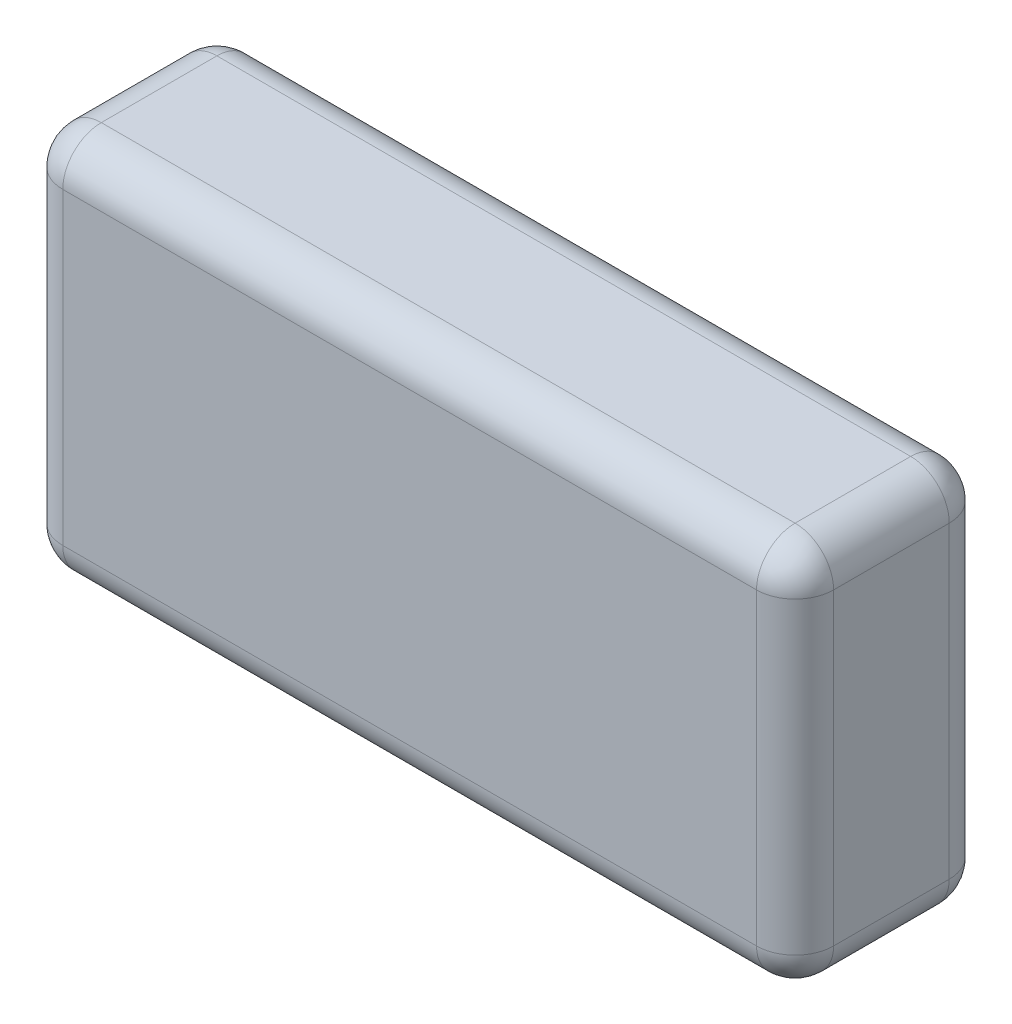
ISO-10303-21;
HEADER;
FILE_DESCRIPTION(('STEP AP214'),'2;1');
FILE_NAME('part.step','',(''),(''),'','','');
FILE_SCHEMA(('AUTOMOTIVE_DESIGN { 1 0 10303 214 1 1 1 1 }'));
ENDSEC;
DATA;
#1=APPLICATION_CONTEXT('core data for automotive mechanical design processes');
#2=APPLICATION_PROTOCOL_DEFINITION('international standard','automotive_design',2000,#1);
#3=PRODUCT_CONTEXT('',#1,'mechanical');
#4=PRODUCT('Part','Part','',(#3));
#5=PRODUCT_RELATED_PRODUCT_CATEGORY('part','',(#4));
#6=PRODUCT_DEFINITION_FORMATION('','',#4);
#7=PRODUCT_DEFINITION_CONTEXT('part definition',#1,'design');
#8=PRODUCT_DEFINITION('design','',#6,#7);
#9=PRODUCT_DEFINITION_SHAPE('','',#8);
#10=(LENGTH_UNIT() NAMED_UNIT(*) SI_UNIT(.MILLI.,.METRE.));
#11=(NAMED_UNIT(*) PLANE_ANGLE_UNIT() SI_UNIT($,.RADIAN.));
#12=(NAMED_UNIT(*) SI_UNIT($,.STERADIAN.) SOLID_ANGLE_UNIT());
#13=UNCERTAINTY_MEASURE_WITH_UNIT(LENGTH_MEASURE(1.E-05),#10,'distance_accuracy_value','');
#14=(GEOMETRIC_REPRESENTATION_CONTEXT(3) GLOBAL_UNCERTAINTY_ASSIGNED_CONTEXT((#13)) GLOBAL_UNIT_ASSIGNED_CONTEXT((#10,
#11,#12)) REPRESENTATION_CONTEXT('',''));
#15=CARTESIAN_POINT('',(0.,0.,0.));
#16=DIRECTION('',(0.,0.,1.));
#17=DIRECTION('',(1.,0.,0.));
#18=AXIS2_PLACEMENT_3D('',#15,#16,#17);
#19=CARTESIAN_POINT('',(-54.0520418666152,100.,-23.4294738015234));
#20=DIRECTION('',(1.,0.,0.));
#21=DIRECTION('',(0.,0.,-1.));
#22=AXIS2_PLACEMENT_3D('',#19,#20,#21);
#23=PLANE('',#22);
#24=DIRECTION('',(0.,0.,1.));
#25=VECTOR('',#24,1.);
#26=CARTESIAN_POINT('',(-54.0520418666152,90.,-23.4294738015234));
#27=LINE('',#26,#25);
#28=CARTESIAN_POINT('',(-54.0520418666152,90.,16.5705261984766));
#29=VERTEX_POINT('',#28);
#30=CARTESIAN_POINT('',(-54.0520418666152,90.,-13.4294738015234));
#31=VERTEX_POINT('',#30);
#32=EDGE_CURVE('E49',#29,#31,#27,.F.);
#33=ORIENTED_EDGE('',*,*,#32,.T.);
#34=DIRECTION('',(0.,-1.,0.));
#35=VECTOR('',#34,1.);
#36=CARTESIAN_POINT('',(-54.0520418666152,100.,-13.4294738015234));
#37=LINE('',#36,#35);
#38=CARTESIAN_POINT('',(-54.0520418666152,9.99999999999999,-13.4294738015234));
#39=VERTEX_POINT('',#38);
#40=EDGE_CURVE('E11',#31,#39,#37,.T.);
#41=ORIENTED_EDGE('',*,*,#40,.T.);
#42=DIRECTION('',(0.,0.,1.));
#43=VECTOR('',#42,1.);
#44=CARTESIAN_POINT('',(-54.0520418666152,9.99999999999999,-23.4294738015234));
#45=LINE('',#44,#43);
#46=CARTESIAN_POINT('',(-54.0520418666152,9.99999999999999,16.5705261984766));
#47=VERTEX_POINT('',#46);
#48=EDGE_CURVE('E266',#39,#47,#45,.T.);
#49=ORIENTED_EDGE('',*,*,#48,.T.);
#50=DIRECTION('',(0.,-1.,0.));
#51=VECTOR('',#50,1.);
#52=CARTESIAN_POINT('',(-54.0520418666152,100.,16.5705261984766));
#53=LINE('',#52,#51);
#54=EDGE_CURVE('E60',#47,#29,#53,.F.);
#55=ORIENTED_EDGE('',*,*,#54,.T.);
#56=EDGE_LOOP('',(#33,#41,#49,#55));
#57=FACE_BOUND('',#56,.T.);
#58=ADVANCED_FACE('F39',(#57),#23,.F.);
#59=CARTESIAN_POINT('',(-54.0520418666152,100.,26.5705261984766));
#60=DIRECTION('',(0.,0.,-1.));
#61=DIRECTION('',(-1.,0.,0.));
#62=AXIS2_PLACEMENT_3D('',#59,#60,#61);
#63=PLANE('',#62);
#64=DIRECTION('',(0.,-1.,0.));
#65=VECTOR('',#64,1.);
#66=CARTESIAN_POINT('',(135.947958133385,100.,26.5705261984766));
#67=LINE('',#66,#65);
#68=CARTESIAN_POINT('',(135.947958133385,9.99999999999999,26.5705261984766));
#69=VERTEX_POINT('',#68);
#70=CARTESIAN_POINT('',(135.947958133385,90.,26.5705261984766));
#71=VERTEX_POINT('',#70);
#72=EDGE_CURVE('E327',#69,#71,#67,.F.);
#73=ORIENTED_EDGE('',*,*,#72,.T.);
#74=DIRECTION('',(1.,0.,0.));
#75=VECTOR('',#74,1.);
#76=CARTESIAN_POINT('',(-54.0520418666152,90.,26.5705261984766));
#77=LINE('',#76,#75);
#78=CARTESIAN_POINT('',(-44.0520418666152,90.,26.5705261984766));
#79=VERTEX_POINT('',#78);
#80=EDGE_CURVE('E238',#71,#79,#77,.F.);
#81=ORIENTED_EDGE('',*,*,#80,.T.);
#82=DIRECTION('',(0.,-1.,0.));
#83=VECTOR('',#82,1.);
#84=CARTESIAN_POINT('',(-44.0520418666152,100.,26.5705261984766));
#85=LINE('',#84,#83);
#86=CARTESIAN_POINT('',(-44.0520418666152,9.99999999999999,26.5705261984766));
#87=VERTEX_POINT('',#86);
#88=EDGE_CURVE('E318',#79,#87,#85,.T.);
#89=ORIENTED_EDGE('',*,*,#88,.T.);
#90=DIRECTION('',(1.,0.,0.));
#91=VECTOR('',#90,1.);
#92=CARTESIAN_POINT('',(-54.0520418666152,9.99999999999999,26.5705261984766));
#93=LINE('',#92,#91);
#94=EDGE_CURVE('E321',#87,#69,#93,.T.);
#95=ORIENTED_EDGE('',*,*,#94,.T.);
#96=EDGE_LOOP('',(#73,#81,#89,#95));
#97=FACE_BOUND('',#96,.T.);
#98=ADVANCED_FACE('F359',(#97),#63,.F.);
#99=CARTESIAN_POINT('',(145.947958133385,100.,-23.4294738015234));
#100=DIRECTION('',(-1.,0.,0.));
#101=DIRECTION('',(0.,0.,1.));
#102=AXIS2_PLACEMENT_3D('',#99,#100,#101);
#103=PLANE('',#102);
#104=DIRECTION('',(0.,-1.,0.));
#105=VECTOR('',#104,1.);
#106=CARTESIAN_POINT('',(145.947958133385,100.,-13.4294738015234));
#107=LINE('',#106,#105);
#108=CARTESIAN_POINT('',(145.947958133385,9.99999999999999,-13.4294738015234));
#109=VERTEX_POINT('',#108);
#110=CARTESIAN_POINT('',(145.947958133385,90.,-13.4294738015234));
#111=VERTEX_POINT('',#110);
#112=EDGE_CURVE('E313',#109,#111,#107,.F.);
#113=ORIENTED_EDGE('',*,*,#112,.T.);
#114=DIRECTION('',(0.,0.,-1.));
#115=VECTOR('',#114,1.);
#116=CARTESIAN_POINT('',(145.947958133385,90.,26.5705261984766));
#117=LINE('',#116,#115);
#118=CARTESIAN_POINT('',(145.947958133385,90.,16.5705261984766));
#119=VERTEX_POINT('',#118);
#120=EDGE_CURVE('E307',#111,#119,#117,.F.);
#121=ORIENTED_EDGE('',*,*,#120,.T.);
#122=DIRECTION('',(0.,-1.,0.));
#123=VECTOR('',#122,1.);
#124=CARTESIAN_POINT('',(145.947958133385,100.,16.5705261984766));
#125=LINE('',#124,#123);
#126=CARTESIAN_POINT('',(145.947958133385,9.99999999999999,16.5705261984766));
#127=VERTEX_POINT('',#126);
#128=EDGE_CURVE('E300',#119,#127,#125,.T.);
#129=ORIENTED_EDGE('',*,*,#128,.T.);
#130=DIRECTION('',(0.,0.,-1.));
#131=VECTOR('',#130,1.);
#132=CARTESIAN_POINT('',(145.947958133385,9.99999999999999,-23.4294738015234));
#133=LINE('',#132,#131);
#134=EDGE_CURVE('E308',#127,#109,#133,.T.);
#135=ORIENTED_EDGE('',*,*,#134,.T.);
#136=EDGE_LOOP('',(#113,#121,#129,#135));
#137=FACE_BOUND('',#136,.T.);
#138=ADVANCED_FACE('F311',(#137),#103,.F.);
#139=CARTESIAN_POINT('',(-54.0520418666152,100.,-23.4294738015234));
#140=DIRECTION('',(0.,0.,1.));
#141=DIRECTION('',(1.,0.,0.));
#142=AXIS2_PLACEMENT_3D('',#139,#140,#141);
#143=PLANE('',#142);
#144=DIRECTION('',(-1.,0.,0.));
#145=VECTOR('',#144,1.);
#146=CARTESIAN_POINT('',(145.947958133385,90.,-23.4294738015234));
#147=LINE('',#146,#145);
#148=CARTESIAN_POINT('',(-44.0520418666152,90.,-23.4294738015234));
#149=VERTEX_POINT('',#148);
#150=CARTESIAN_POINT('',(135.947958133385,90.,-23.4294738015234));
#151=VERTEX_POINT('',#150);
#152=EDGE_CURVE('E162',#149,#151,#147,.F.);
#153=ORIENTED_EDGE('',*,*,#152,.T.);
#154=DIRECTION('',(0.,-1.,0.));
#155=VECTOR('',#154,1.);
#156=CARTESIAN_POINT('',(135.947958133385,100.,-23.4294738015234));
#157=LINE('',#156,#155);
#158=CARTESIAN_POINT('',(135.947958133385,9.99999999999999,-23.4294738015234));
#159=VERTEX_POINT('',#158);
#160=EDGE_CURVE('E262',#151,#159,#157,.T.);
#161=ORIENTED_EDGE('',*,*,#160,.T.);
#162=DIRECTION('',(-1.,0.,0.));
#163=VECTOR('',#162,1.);
#164=CARTESIAN_POINT('',(-54.0520418666152,9.99999999999999,-23.4294738015234));
#165=LINE('',#164,#163);
#166=CARTESIAN_POINT('',(-44.0520418666152,9.99999999999999,-23.4294738015234));
#167=VERTEX_POINT('',#166);
#168=EDGE_CURVE('E253',#159,#167,#165,.T.);
#169=ORIENTED_EDGE('',*,*,#168,.T.);
#170=DIRECTION('',(0.,-1.,0.));
#171=VECTOR('',#170,1.);
#172=CARTESIAN_POINT('',(-44.0520418666152,100.,-23.4294738015234));
#173=LINE('',#172,#171);
#174=EDGE_CURVE('E249',#167,#149,#173,.F.);
#175=ORIENTED_EDGE('',*,*,#174,.T.);
#176=EDGE_LOOP('',(#153,#161,#169,#175));
#177=FACE_BOUND('',#176,.T.);
#178=ADVANCED_FACE('F543',(#177),#143,.F.);
#179=CARTESIAN_POINT('',(0.,100.,0.));
#180=DIRECTION('',(0.,1.,0.));
#181=DIRECTION('',(0.,0.,1.));
#182=AXIS2_PLACEMENT_3D('',#179,#180,#181);
#183=PLANE('',#182);
#184=DIRECTION('',(1.,0.,0.));
#185=VECTOR('',#184,1.);
#186=CARTESIAN_POINT('',(145.947958133385,100.,16.5705261984766));
#187=LINE('',#186,#185);
#188=CARTESIAN_POINT('',(-44.0520418666152,100.,16.5705261984766));
#189=VERTEX_POINT('',#188);
#190=CARTESIAN_POINT('',(135.947958133385,100.,16.5705261984766));
#191=VERTEX_POINT('',#190);
#192=EDGE_CURVE('E139',#189,#191,#187,.T.);
#193=ORIENTED_EDGE('',*,*,#192,.T.);
#194=DIRECTION('',(0.,0.,-1.));
#195=VECTOR('',#194,1.);
#196=CARTESIAN_POINT('',(135.947958133385,100.,-23.4294738015234));
#197=LINE('',#196,#195);
#198=CARTESIAN_POINT('',(135.947958133385,100.,-13.4294738015234));
#199=VERTEX_POINT('',#198);
#200=EDGE_CURVE('E134',#191,#199,#197,.T.);
#201=ORIENTED_EDGE('',*,*,#200,.T.);
#202=DIRECTION('',(-1.,0.,0.));
#203=VECTOR('',#202,1.);
#204=CARTESIAN_POINT('',(-54.0520418666152,100.,-13.4294738015234));
#205=LINE('',#204,#203);
#206=CARTESIAN_POINT('',(-44.0520418666152,100.,-13.4294738015234));
#207=VERTEX_POINT('',#206);
#208=EDGE_CURVE('E128',#199,#207,#205,.T.);
#209=ORIENTED_EDGE('',*,*,#208,.T.);
#210=DIRECTION('',(0.,0.,1.));
#211=VECTOR('',#210,1.);
#212=CARTESIAN_POINT('',(-44.0520418666152,100.,26.5705261984766));
#213=LINE('',#212,#211);
#214=EDGE_CURVE('E131',#207,#189,#213,.T.);
#215=ORIENTED_EDGE('',*,*,#214,.T.);
#216=EDGE_LOOP('',(#193,#201,#209,#215));
#217=FACE_BOUND('',#216,.T.);
#218=ADVANCED_FACE('F130',(#217),#183,.T.);
#219=CARTESIAN_POINT('',(0.,0.,0.));
#220=DIRECTION('',(0.,1.,0.));
#221=DIRECTION('',(0.,0.,1.));
#222=AXIS2_PLACEMENT_3D('',#219,#220,#221);
#223=PLANE('',#222);
#224=DIRECTION('',(0.,0.,-1.));
#225=VECTOR('',#224,1.);
#226=CARTESIAN_POINT('',(135.947958133385,0.,0.));
#227=LINE('',#226,#225);
#228=CARTESIAN_POINT('',(135.947958133385,0.,-13.4294738015234));
#229=VERTEX_POINT('',#228);
#230=CARTESIAN_POINT('',(135.947958133385,0.,16.5705261984766));
#231=VERTEX_POINT('',#230);
#232=EDGE_CURVE('E244',#229,#231,#227,.F.);
#233=ORIENTED_EDGE('',*,*,#232,.T.);
#234=DIRECTION('',(1.,0.,0.));
#235=VECTOR('',#234,1.);
#236=CARTESIAN_POINT('',(0.,0.,16.5705261984766));
#237=LINE('',#236,#235);
#238=CARTESIAN_POINT('',(-44.0520418666152,0.,16.5705261984766));
#239=VERTEX_POINT('',#238);
#240=EDGE_CURVE('E241',#231,#239,#237,.F.);
#241=ORIENTED_EDGE('',*,*,#240,.T.);
#242=DIRECTION('',(0.,0.,1.));
#243=VECTOR('',#242,1.);
#244=CARTESIAN_POINT('',(-44.0520418666152,0.,0.));
#245=LINE('',#244,#243);
#246=CARTESIAN_POINT('',(-44.0520418666152,0.,-13.4294738015234));
#247=VERTEX_POINT('',#246);
#248=EDGE_CURVE('E233',#239,#247,#245,.F.);
#249=ORIENTED_EDGE('',*,*,#248,.T.);
#250=DIRECTION('',(-1.,0.,0.));
#251=VECTOR('',#250,1.);
#252=CARTESIAN_POINT('',(0.,0.,-13.4294738015234));
#253=LINE('',#252,#251);
#254=EDGE_CURVE('E237',#247,#229,#253,.F.);
#255=ORIENTED_EDGE('',*,*,#254,.T.);
#256=EDGE_LOOP('',(#233,#241,#249,#255));
#257=FACE_BOUND('',#256,.T.);
#258=ADVANCED_FACE('F242',(#257),#223,.F.);
#259=CARTESIAN_POINT('',(-44.0520418666152,9.99999999999999,-23.4294738015234));
#260=DIRECTION('',(0.,0.,1.));
#261=DIRECTION('',(1.,0.,0.));
#262=AXIS2_PLACEMENT_3D('',#259,#260,#261);
#263=CYLINDRICAL_SURFACE('',#262,10.);
#264=CARTESIAN_POINT('',(-44.0520418666152,9.99999999999999,16.5705261984766));
#265=DIRECTION('',(0.,0.,1.));
#266=DIRECTION('',(1.,0.,0.));
#267=AXIS2_PLACEMENT_3D('',#264,#265,#266);
#268=CIRCLE('',#267,10.);
#269=EDGE_CURVE('E43',#47,#239,#268,.T.);
#270=ORIENTED_EDGE('',*,*,#269,.F.);
#271=ORIENTED_EDGE('',*,*,#48,.F.);
#272=CARTESIAN_POINT('',(-44.0520418666152,10.,-13.4294738015234));
#273=DIRECTION('',(0.,0.,-1.));
#274=DIRECTION('',(-1.,0.,0.));
#275=AXIS2_PLACEMENT_3D('',#272,#273,#274);
#276=CIRCLE('',#275,10.);
#277=EDGE_CURVE('E215',#247,#39,#276,.T.);
#278=ORIENTED_EDGE('',*,*,#277,.F.);
#279=ORIENTED_EDGE('',*,*,#248,.F.);
#280=EDGE_LOOP('',(#270,#271,#278,#279));
#281=FACE_BOUND('',#280,.T.);
#282=ADVANCED_FACE('F41',(#281),#263,.T.);
#283=CARTESIAN_POINT('',(-44.0520418666152,10.,16.5705261984766));
#284=DIRECTION('',(0.,0.,1.));
#285=DIRECTION('',(1.,0.,0.));
#286=AXIS2_PLACEMENT_3D('',#283,#284,#285);
#287=SPHERICAL_SURFACE('',#286,10.);
#288=CARTESIAN_POINT('',(-44.0520418666152,9.99999999999999,16.5705261984766));
#289=DIRECTION('',(0.,-1.,0.));
#290=DIRECTION('',(0.,0.,-1.));
#291=AXIS2_PLACEMENT_3D('',#288,#289,#290);
#292=CIRCLE('',#291,10.);
#293=EDGE_CURVE('E209',#47,#87,#292,.F.);
#294=ORIENTED_EDGE('',*,*,#293,.F.);
#295=ORIENTED_EDGE('',*,*,#269,.T.);
#296=CARTESIAN_POINT('',(-44.0520418666152,10.,16.5705261984766));
#297=DIRECTION('',(-1.,0.,0.));
#298=DIRECTION('',(0.,0.,1.));
#299=AXIS2_PLACEMENT_3D('',#296,#297,#298);
#300=CIRCLE('',#299,10.);
#301=EDGE_CURVE('E213',#87,#239,#300,.F.);
#302=ORIENTED_EDGE('',*,*,#301,.F.);
#303=EDGE_LOOP('',(#294,#295,#302));
#304=FACE_BOUND('',#303,.T.);
#305=ADVANCED_FACE('F230',(#304),#287,.T.);
#306=CARTESIAN_POINT('',(-44.0520418666152,10.,-13.4294738015234));
#307=DIRECTION('',(0.,0.,1.));
#308=DIRECTION('',(1.,0.,0.));
#309=AXIS2_PLACEMENT_3D('',#306,#307,#308);
#310=SPHERICAL_SURFACE('',#309,10.);
#311=CARTESIAN_POINT('',(-44.0520418666152,9.99999999999999,-13.4294738015234));
#312=DIRECTION('',(-1.,0.,0.));
#313=DIRECTION('',(0.,0.,1.));
#314=AXIS2_PLACEMENT_3D('',#311,#312,#313);
#315=CIRCLE('',#314,10.);
#316=EDGE_CURVE('E202',#247,#167,#315,.F.);
#317=ORIENTED_EDGE('',*,*,#316,.F.);
#318=ORIENTED_EDGE('',*,*,#277,.T.);
#319=CARTESIAN_POINT('',(-44.0520418666152,9.99999999999999,-13.4294738015234));
#320=DIRECTION('',(0.,-1.,0.));
#321=DIRECTION('',(0.,0.,-1.));
#322=AXIS2_PLACEMENT_3D('',#319,#320,#321);
#323=CIRCLE('',#322,10.);
#324=EDGE_CURVE('E206',#167,#39,#323,.F.);
#325=ORIENTED_EDGE('',*,*,#324,.F.);
#326=EDGE_LOOP('',(#317,#318,#325));
#327=FACE_BOUND('',#326,.T.);
#328=ADVANCED_FACE('F509',(#327),#310,.T.);
#329=CARTESIAN_POINT('',(-54.0520418666152,9.99999999999999,16.5705261984766));
#330=DIRECTION('',(1.,0.,0.));
#331=DIRECTION('',(0.,0.,-1.));
#332=AXIS2_PLACEMENT_3D('',#329,#330,#331);
#333=CYLINDRICAL_SURFACE('',#332,10.);
#334=ORIENTED_EDGE('',*,*,#301,.T.);
#335=ORIENTED_EDGE('',*,*,#240,.F.);
#336=CARTESIAN_POINT('',(135.947958133385,9.99999999999999,16.5705261984766));
#337=DIRECTION('',(1.,0.,0.));
#338=DIRECTION('',(0.,0.,-1.));
#339=AXIS2_PLACEMENT_3D('',#336,#337,#338);
#340=CIRCLE('',#339,10.);
#341=EDGE_CURVE('E194',#69,#231,#340,.T.);
#342=ORIENTED_EDGE('',*,*,#341,.F.);
#343=ORIENTED_EDGE('',*,*,#94,.F.);
#344=EDGE_LOOP('',(#334,#335,#342,#343));
#345=FACE_BOUND('',#344,.T.);
#346=ADVANCED_FACE('F361',(#345),#333,.T.);
#347=CARTESIAN_POINT('',(-44.0520418666152,100.,16.5705261984766));
#348=DIRECTION('',(0.,-1.,0.));
#349=DIRECTION('',(0.,0.,-1.));
#350=AXIS2_PLACEMENT_3D('',#347,#348,#349);
#351=CYLINDRICAL_SURFACE('',#350,10.);
#352=ORIENTED_EDGE('',*,*,#293,.T.);
#353=ORIENTED_EDGE('',*,*,#88,.F.);
#354=CARTESIAN_POINT('',(-44.0520418666152,90.,16.5705261984766));
#355=DIRECTION('',(0.,1.,0.));
#356=DIRECTION('',(0.,0.,1.));
#357=AXIS2_PLACEMENT_3D('',#354,#355,#356);
#358=CIRCLE('',#357,10.);
#359=EDGE_CURVE('E190',#29,#79,#358,.T.);
#360=ORIENTED_EDGE('',*,*,#359,.F.);
#361=ORIENTED_EDGE('',*,*,#54,.F.);
#362=EDGE_LOOP('',(#352,#353,#360,#361));
#363=FACE_BOUND('',#362,.T.);
#364=ADVANCED_FACE('F493',(#363),#351,.T.);
#365=CARTESIAN_POINT('',(-44.0520418666152,90.,0.));
#366=DIRECTION('',(0.,0.,-1.));
#367=DIRECTION('',(-1.,0.,0.));
#368=AXIS2_PLACEMENT_3D('',#365,#366,#367);
#369=CYLINDRICAL_SURFACE('',#368,10.);
#370=CARTESIAN_POINT('',(-44.0520418666152,90.,-13.4294738015234));
#371=DIRECTION('',(0.,0.,-1.));
#372=DIRECTION('',(-1.,0.,0.));
#373=AXIS2_PLACEMENT_3D('',#370,#371,#372);
#374=CIRCLE('',#373,10.);
#375=EDGE_CURVE('E145',#31,#207,#374,.T.);
#376=ORIENTED_EDGE('',*,*,#375,.F.);
#377=ORIENTED_EDGE('',*,*,#32,.F.);
#378=CARTESIAN_POINT('',(-44.0520418666152,90.,16.5705261984766));
#379=DIRECTION('',(0.,0.,1.));
#380=DIRECTION('',(1.,0.,0.));
#381=AXIS2_PLACEMENT_3D('',#378,#379,#380);
#382=CIRCLE('',#381,10.);
#383=EDGE_CURVE('E148',#189,#29,#382,.T.);
#384=ORIENTED_EDGE('',*,*,#383,.F.);
#385=ORIENTED_EDGE('',*,*,#214,.F.);
#386=EDGE_LOOP('',(#376,#377,#384,#385));
#387=FACE_BOUND('',#386,.T.);
#388=ADVANCED_FACE('F144',(#387),#369,.T.);
#389=CARTESIAN_POINT('',(-44.0520418666152,100.,-13.4294738015234));
#390=DIRECTION('',(0.,-1.,0.));
#391=DIRECTION('',(0.,0.,-1.));
#392=AXIS2_PLACEMENT_3D('',#389,#390,#391);
#393=CYLINDRICAL_SURFACE('',#392,10.);
#394=ORIENTED_EDGE('',*,*,#324,.T.);
#395=ORIENTED_EDGE('',*,*,#40,.F.);
#396=CARTESIAN_POINT('',(-44.0520418666152,90.,-13.4294738015234));
#397=DIRECTION('',(0.,1.,0.));
#398=DIRECTION('',(0.,0.,1.));
#399=AXIS2_PLACEMENT_3D('',#396,#397,#398);
#400=CIRCLE('',#399,10.);
#401=EDGE_CURVE('E158',#149,#31,#400,.T.);
#402=ORIENTED_EDGE('',*,*,#401,.F.);
#403=ORIENTED_EDGE('',*,*,#174,.F.);
#404=EDGE_LOOP('',(#394,#395,#402,#403));
#405=FACE_BOUND('',#404,.T.);
#406=ADVANCED_FACE('F477',(#405),#393,.T.);
#407=CARTESIAN_POINT('',(-54.0520418666152,9.99999999999999,-13.4294738015234));
#408=DIRECTION('',(-1.,0.,0.));
#409=DIRECTION('',(0.,0.,1.));
#410=AXIS2_PLACEMENT_3D('',#407,#408,#409);
#411=CYLINDRICAL_SURFACE('',#410,10.);
#412=ORIENTED_EDGE('',*,*,#316,.T.);
#413=ORIENTED_EDGE('',*,*,#168,.F.);
#414=CARTESIAN_POINT('',(135.947958133385,10.,-13.4294738015234));
#415=DIRECTION('',(1.,0.,0.));
#416=DIRECTION('',(0.,0.,-1.));
#417=AXIS2_PLACEMENT_3D('',#414,#415,#416);
#418=CIRCLE('',#417,10.);
#419=EDGE_CURVE('E182',#229,#159,#418,.T.);
#420=ORIENTED_EDGE('',*,*,#419,.F.);
#421=ORIENTED_EDGE('',*,*,#254,.F.);
#422=EDGE_LOOP('',(#412,#413,#420,#421));
#423=FACE_BOUND('',#422,.T.);
#424=ADVANCED_FACE('F341',(#423),#411,.T.);
#425=CARTESIAN_POINT('',(135.947958133385,9.99999999999999,-23.4294738015234));
#426=DIRECTION('',(0.,0.,-1.));
#427=DIRECTION('',(-1.,0.,0.));
#428=AXIS2_PLACEMENT_3D('',#425,#426,#427);
#429=CYLINDRICAL_SURFACE('',#428,10.);
#430=CARTESIAN_POINT('',(135.947958133385,10.,16.5705261984766));
#431=DIRECTION('',(0.,0.,1.));
#432=DIRECTION('',(1.,0.,0.));
#433=AXIS2_PLACEMENT_3D('',#430,#431,#432);
#434=CIRCLE('',#433,10.);
#435=EDGE_CURVE('E198',#231,#127,#434,.T.);
#436=ORIENTED_EDGE('',*,*,#435,.F.);
#437=ORIENTED_EDGE('',*,*,#232,.F.);
#438=CARTESIAN_POINT('',(135.947958133385,9.99999999999999,-13.4294738015234));
#439=DIRECTION('',(0.,0.,-1.));
#440=DIRECTION('',(-1.,0.,0.));
#441=AXIS2_PLACEMENT_3D('',#438,#439,#440);
#442=CIRCLE('',#441,10.);
#443=EDGE_CURVE('E178',#109,#229,#442,.T.);
#444=ORIENTED_EDGE('',*,*,#443,.F.);
#445=ORIENTED_EDGE('',*,*,#134,.F.);
#446=EDGE_LOOP('',(#436,#437,#444,#445));
#447=FACE_BOUND('',#446,.T.);
#448=ADVANCED_FACE('F338',(#447),#429,.T.);
#449=CARTESIAN_POINT('',(135.947958133385,10.,16.5705261984766));
#450=DIRECTION('',(0.,0.,1.));
#451=DIRECTION('',(1.,0.,0.));
#452=AXIS2_PLACEMENT_3D('',#449,#450,#451);
#453=SPHERICAL_SURFACE('',#452,10.);
#454=ORIENTED_EDGE('',*,*,#341,.T.);
#455=ORIENTED_EDGE('',*,*,#435,.T.);
#456=CARTESIAN_POINT('',(135.947958133385,9.99999999999999,16.5705261984766));
#457=DIRECTION('',(0.,-1.,0.));
#458=DIRECTION('',(0.,0.,-1.));
#459=AXIS2_PLACEMENT_3D('',#456,#457,#458);
#460=CIRCLE('',#459,10.);
#461=EDGE_CURVE('E169',#69,#127,#460,.F.);
#462=ORIENTED_EDGE('',*,*,#461,.F.);
#463=EDGE_LOOP('',(#454,#455,#462));
#464=FACE_BOUND('',#463,.T.);
#465=ADVANCED_FACE('F363',(#464),#453,.T.);
#466=CARTESIAN_POINT('',(-44.0520418666152,90.,16.5705261984766));
#467=DIRECTION('',(0.,0.,1.));
#468=DIRECTION('',(1.,0.,0.));
#469=AXIS2_PLACEMENT_3D('',#466,#467,#468);
#470=SPHERICAL_SURFACE('',#469,10.);
#471=ORIENTED_EDGE('',*,*,#383,.T.);
#472=ORIENTED_EDGE('',*,*,#359,.T.);
#473=CARTESIAN_POINT('',(-44.0520418666152,90.,16.5705261984766));
#474=DIRECTION('',(-1.,0.,0.));
#475=DIRECTION('',(0.,0.,1.));
#476=AXIS2_PLACEMENT_3D('',#473,#474,#475);
#477=CIRCLE('',#476,10.);
#478=EDGE_CURVE('E164',#189,#79,#477,.F.);
#479=ORIENTED_EDGE('',*,*,#478,.F.);
#480=EDGE_LOOP('',(#471,#472,#479));
#481=FACE_BOUND('',#480,.T.);
#482=ADVANCED_FACE('F365',(#481),#470,.T.);
#483=CARTESIAN_POINT('',(-44.0520418666152,90.,-13.4294738015234));
#484=DIRECTION('',(0.,0.,1.));
#485=DIRECTION('',(1.,0.,0.));
#486=AXIS2_PLACEMENT_3D('',#483,#484,#485);
#487=SPHERICAL_SURFACE('',#486,10.);
#488=ORIENTED_EDGE('',*,*,#401,.T.);
#489=ORIENTED_EDGE('',*,*,#375,.T.);
#490=CARTESIAN_POINT('',(-44.0520418666152,90.,-13.4294738015234));
#491=DIRECTION('',(-1.,0.,0.));
#492=DIRECTION('',(0.,0.,1.));
#493=AXIS2_PLACEMENT_3D('',#490,#491,#492);
#494=CIRCLE('',#493,10.);
#495=EDGE_CURVE('E155',#149,#207,#494,.F.);
#496=ORIENTED_EDGE('',*,*,#495,.F.);
#497=EDGE_LOOP('',(#488,#489,#496));
#498=FACE_BOUND('',#497,.T.);
#499=ADVANCED_FACE('F154',(#498),#487,.T.);
#500=CARTESIAN_POINT('',(135.947958133385,10.,-13.4294738015234));
#501=DIRECTION('',(0.,0.,1.));
#502=DIRECTION('',(1.,0.,0.));
#503=AXIS2_PLACEMENT_3D('',#500,#501,#502);
#504=SPHERICAL_SURFACE('',#503,10.);
#505=ORIENTED_EDGE('',*,*,#443,.T.);
#506=ORIENTED_EDGE('',*,*,#419,.T.);
#507=CARTESIAN_POINT('',(135.947958133385,9.99999999999999,-13.4294738015234));
#508=DIRECTION('',(0.,-1.,0.));
#509=DIRECTION('',(0.,0.,-1.));
#510=AXIS2_PLACEMENT_3D('',#507,#508,#509);
#511=CIRCLE('',#510,10.);
#512=EDGE_CURVE('E165',#109,#159,#511,.F.);
#513=ORIENTED_EDGE('',*,*,#512,.F.);
#514=EDGE_LOOP('',(#505,#506,#513));
#515=FACE_BOUND('',#514,.T.);
#516=ADVANCED_FACE('F343',(#515),#504,.T.);
#517=CARTESIAN_POINT('',(135.947958133385,100.,16.5705261984766));
#518=DIRECTION('',(0.,-1.,0.));
#519=DIRECTION('',(0.,0.,-1.));
#520=AXIS2_PLACEMENT_3D('',#517,#518,#519);
#521=CYLINDRICAL_SURFACE('',#520,10.);
#522=ORIENTED_EDGE('',*,*,#461,.T.);
#523=ORIENTED_EDGE('',*,*,#128,.F.);
#524=CARTESIAN_POINT('',(135.947958133385,90.,16.5705261984766));
#525=DIRECTION('',(0.,1.,0.));
#526=DIRECTION('',(0.,0.,1.));
#527=AXIS2_PLACEMENT_3D('',#524,#525,#526);
#528=CIRCLE('',#527,10.);
#529=EDGE_CURVE('E171',#71,#119,#528,.T.);
#530=ORIENTED_EDGE('',*,*,#529,.F.);
#531=ORIENTED_EDGE('',*,*,#72,.F.);
#532=EDGE_LOOP('',(#522,#523,#530,#531));
#533=FACE_BOUND('',#532,.T.);
#534=ADVANCED_FACE('F302',(#533),#521,.T.);
#535=CARTESIAN_POINT('',(0.,90.,16.5705261984766));
#536=DIRECTION('',(-1.,0.,0.));
#537=DIRECTION('',(0.,0.,1.));
#538=AXIS2_PLACEMENT_3D('',#535,#536,#537);
#539=CYLINDRICAL_SURFACE('',#538,10.);
#540=ORIENTED_EDGE('',*,*,#478,.T.);
#541=ORIENTED_EDGE('',*,*,#80,.F.);
#542=CARTESIAN_POINT('',(135.947958133385,90.,16.5705261984766));
#543=DIRECTION('',(1.,0.,0.));
#544=DIRECTION('',(0.,0.,-1.));
#545=AXIS2_PLACEMENT_3D('',#542,#543,#544);
#546=CIRCLE('',#545,10.);
#547=EDGE_CURVE('E287',#191,#71,#546,.T.);
#548=ORIENTED_EDGE('',*,*,#547,.F.);
#549=ORIENTED_EDGE('',*,*,#192,.F.);
#550=EDGE_LOOP('',(#540,#541,#548,#549));
#551=FACE_BOUND('',#550,.T.);
#552=ADVANCED_FACE('F357',(#551),#539,.T.);
#553=CARTESIAN_POINT('',(0.,90.,-13.4294738015234));
#554=DIRECTION('',(1.,0.,0.));
#555=DIRECTION('',(0.,0.,-1.));
#556=AXIS2_PLACEMENT_3D('',#553,#554,#555);
#557=CYLINDRICAL_SURFACE('',#556,10.);
#558=ORIENTED_EDGE('',*,*,#495,.T.);
#559=ORIENTED_EDGE('',*,*,#208,.F.);
#560=CARTESIAN_POINT('',(135.947958133385,90.,-13.4294738015234));
#561=DIRECTION('',(1.,0.,0.));
#562=DIRECTION('',(0.,0.,-1.));
#563=AXIS2_PLACEMENT_3D('',#560,#561,#562);
#564=CIRCLE('',#563,10.);
#565=EDGE_CURVE('E283',#151,#199,#564,.T.);
#566=ORIENTED_EDGE('',*,*,#565,.F.);
#567=ORIENTED_EDGE('',*,*,#152,.F.);
#568=EDGE_LOOP('',(#558,#559,#566,#567));
#569=FACE_BOUND('',#568,.T.);
#570=ADVANCED_FACE('F161',(#569),#557,.T.);
#571=CARTESIAN_POINT('',(135.947958133385,100.,-13.4294738015234));
#572=DIRECTION('',(0.,-1.,0.));
#573=DIRECTION('',(0.,0.,-1.));
#574=AXIS2_PLACEMENT_3D('',#571,#572,#573);
#575=CYLINDRICAL_SURFACE('',#574,10.);
#576=ORIENTED_EDGE('',*,*,#512,.T.);
#577=ORIENTED_EDGE('',*,*,#160,.F.);
#578=CARTESIAN_POINT('',(135.947958133385,90.,-13.4294738015234));
#579=DIRECTION('',(0.,1.,0.));
#580=DIRECTION('',(0.,0.,1.));
#581=AXIS2_PLACEMENT_3D('',#578,#579,#580);
#582=CIRCLE('',#581,10.);
#583=EDGE_CURVE('E279',#111,#151,#582,.T.);
#584=ORIENTED_EDGE('',*,*,#583,.F.);
#585=ORIENTED_EDGE('',*,*,#112,.F.);
#586=EDGE_LOOP('',(#576,#577,#584,#585));
#587=FACE_BOUND('',#586,.T.);
#588=ADVANCED_FACE('F346',(#587),#575,.T.);
#589=CARTESIAN_POINT('',(135.947958133385,90.,16.5705261984766));
#590=DIRECTION('',(0.,0.,1.));
#591=DIRECTION('',(1.,0.,0.));
#592=AXIS2_PLACEMENT_3D('',#589,#590,#591);
#593=SPHERICAL_SURFACE('',#592,10.);
#594=ORIENTED_EDGE('',*,*,#547,.T.);
#595=ORIENTED_EDGE('',*,*,#529,.T.);
#596=CARTESIAN_POINT('',(135.947958133385,90.,16.5705261984766));
#597=DIRECTION('',(0.,0.,1.));
#598=DIRECTION('',(1.,0.,0.));
#599=AXIS2_PLACEMENT_3D('',#596,#597,#598);
#600=CIRCLE('',#599,10.);
#601=EDGE_CURVE('E276',#191,#119,#600,.F.);
#602=ORIENTED_EDGE('',*,*,#601,.F.);
#603=EDGE_LOOP('',(#594,#595,#602));
#604=FACE_BOUND('',#603,.T.);
#605=ADVANCED_FACE('F296',(#604),#593,.T.);
#606=CARTESIAN_POINT('',(135.947958133385,90.,-13.4294738015234));
#607=DIRECTION('',(0.,0.,1.));
#608=DIRECTION('',(1.,0.,0.));
#609=AXIS2_PLACEMENT_3D('',#606,#607,#608);
#610=SPHERICAL_SURFACE('',#609,10.);
#611=ORIENTED_EDGE('',*,*,#583,.T.);
#612=ORIENTED_EDGE('',*,*,#565,.T.);
#613=CARTESIAN_POINT('',(135.947958133385,90.,-13.4294738015234));
#614=DIRECTION('',(0.,0.,-1.));
#615=DIRECTION('',(-1.,0.,0.));
#616=AXIS2_PLACEMENT_3D('',#613,#614,#615);
#617=CIRCLE('',#616,10.);
#618=EDGE_CURVE('E273',#111,#199,#617,.F.);
#619=ORIENTED_EDGE('',*,*,#618,.F.);
#620=EDGE_LOOP('',(#611,#612,#619));
#621=FACE_BOUND('',#620,.T.);
#622=ADVANCED_FACE('F385',(#621),#610,.T.);
#623=CARTESIAN_POINT('',(135.947958133385,90.,0.));
#624=DIRECTION('',(0.,0.,1.));
#625=DIRECTION('',(1.,0.,0.));
#626=AXIS2_PLACEMENT_3D('',#623,#624,#625);
#627=CYLINDRICAL_SURFACE('',#626,10.);
#628=ORIENTED_EDGE('',*,*,#601,.T.);
#629=ORIENTED_EDGE('',*,*,#120,.F.);
#630=ORIENTED_EDGE('',*,*,#618,.T.);
#631=ORIENTED_EDGE('',*,*,#200,.F.);
#632=EDGE_LOOP('',(#628,#629,#630,#631));
#633=FACE_BOUND('',#632,.T.);
#634=ADVANCED_FACE('F382',(#633),#627,.T.);
#635=CLOSED_SHELL('',(#58,#98,#138,#178,#218,#258,#282,#305,#328,#346,#364,#388,#406,#424,#448,
#465,#482,#499,#516,#534,#552,#570,#588,#605,#622,#634));
#636=MANIFOLD_SOLID_BREP('B2',#635);
#637=ADVANCED_BREP_SHAPE_REPRESENTATION('',(#18,#636),#14);
#638=SHAPE_DEFINITION_REPRESENTATION(#9,#637);
ENDSEC;
END-ISO-10303-21;
